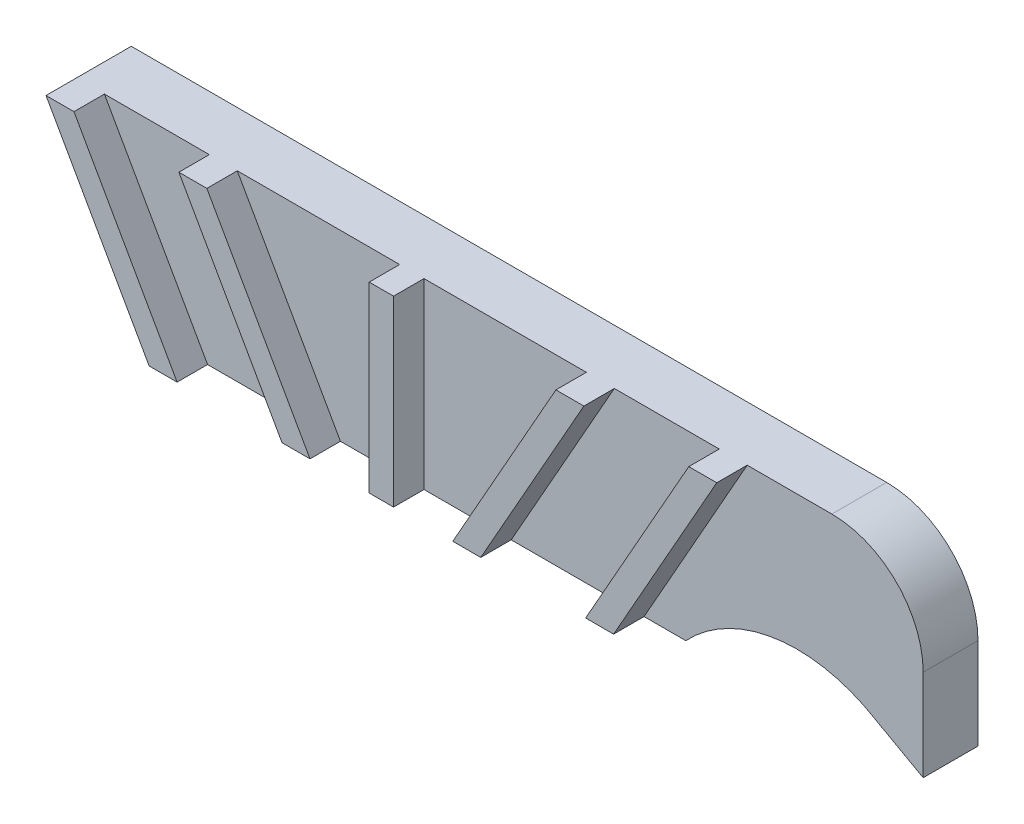
ISO-10303-21;
HEADER;
FILE_DESCRIPTION(('STEP AP214'),'2;1');
FILE_NAME('part.step','',(''),(''),'','','');
FILE_SCHEMA(('AUTOMOTIVE_DESIGN { 1 0 10303 214 1 1 1 1 }'));
ENDSEC;
DATA;
#1=APPLICATION_CONTEXT('core data for automotive mechanical design processes');
#2=APPLICATION_PROTOCOL_DEFINITION('international standard','automotive_design',2000,#1);
#3=PRODUCT_CONTEXT('',#1,'mechanical');
#4=PRODUCT('Part','Part','',(#3));
#5=PRODUCT_RELATED_PRODUCT_CATEGORY('part','',(#4));
#6=PRODUCT_DEFINITION_FORMATION('','',#4);
#7=PRODUCT_DEFINITION_CONTEXT('part definition',#1,'design');
#8=PRODUCT_DEFINITION('design','',#6,#7);
#9=PRODUCT_DEFINITION_SHAPE('','',#8);
#10=(LENGTH_UNIT() NAMED_UNIT(*) SI_UNIT(.MILLI.,.METRE.));
#11=(NAMED_UNIT(*) PLANE_ANGLE_UNIT() SI_UNIT($,.RADIAN.));
#12=(NAMED_UNIT(*) SI_UNIT($,.STERADIAN.) SOLID_ANGLE_UNIT());
#13=UNCERTAINTY_MEASURE_WITH_UNIT(LENGTH_MEASURE(1.E-05),#10,'distance_accuracy_value','');
#14=(GEOMETRIC_REPRESENTATION_CONTEXT(3) GLOBAL_UNCERTAINTY_ASSIGNED_CONTEXT((#13)) GLOBAL_UNIT_ASSIGNED_CONTEXT((#10,
#11,#12)) REPRESENTATION_CONTEXT('',''));
#15=CARTESIAN_POINT('',(0.,0.,0.));
#16=DIRECTION('',(0.,0.,1.));
#17=DIRECTION('',(1.,0.,0.));
#18=AXIS2_PLACEMENT_3D('',#15,#16,#17);
#19=CARTESIAN_POINT('',(13.5532855236969,-5.12294160247242,2.8));
#20=DIRECTION('',(-1.,0.,0.));
#21=DIRECTION('',(0.,0.,1.));
#22=AXIS2_PLACEMENT_3D('',#19,#20,#21);
#23=PLANE('',#22);
#24=DIRECTION('',(0.,-1.,0.));
#25=VECTOR('',#24,1.);
#26=CARTESIAN_POINT('',(13.5532855236969,-8.1229416024724,1.8));
#27=LINE('',#26,#25);
#28=CARTESIAN_POINT('',(13.5532855236969,-5.12294160247242,1.8));
#29=VERTEX_POINT('',#28);
#30=CARTESIAN_POINT('',(13.5532855236969,-8.1229416024724,1.8));
#31=VERTEX_POINT('',#30);
#32=EDGE_CURVE('E243',#29,#31,#27,.T.);
#33=ORIENTED_EDGE('',*,*,#32,.T.);
#34=DIRECTION('',(0.,0.,-1.));
#35=VECTOR('',#34,1.);
#36=CARTESIAN_POINT('',(13.5532855236969,-8.1229416024724,2.8));
#37=LINE('',#36,#35);
#38=CARTESIAN_POINT('',(13.5532855236969,-8.1229416024724,0.));
#39=VERTEX_POINT('',#38);
#40=EDGE_CURVE('E384',#31,#39,#37,.T.);
#41=ORIENTED_EDGE('',*,*,#40,.T.);
#42=DIRECTION('',(0.,-1.,0.));
#43=VECTOR('',#42,1.);
#44=CARTESIAN_POINT('',(13.5532855236969,-5.12294160247242,0.));
#45=LINE('',#44,#43);
#46=CARTESIAN_POINT('',(13.5532855236969,-5.12294160247242,0.));
#47=VERTEX_POINT('',#46);
#48=EDGE_CURVE('E364',#47,#39,#45,.T.);
#49=ORIENTED_EDGE('',*,*,#48,.F.);
#50=DIRECTION('',(0.,0.,-1.));
#51=VECTOR('',#50,1.);
#52=CARTESIAN_POINT('',(13.5532855236969,-5.12294160247242,2.8));
#53=LINE('',#52,#51);
#54=EDGE_CURVE('E387',#29,#47,#53,.T.);
#55=ORIENTED_EDGE('',*,*,#54,.F.);
#56=EDGE_LOOP('',(#33,#41,#49,#55));
#57=FACE_BOUND('',#56,.T.);
#58=ADVANCED_FACE('F41',(#57),#23,.F.);
#59=CARTESIAN_POINT('',(5.75682858143594,-8.1229416024724,2.8));
#60=DIRECTION('',(0.,1.,0.));
#61=DIRECTION('',(1.,0.,0.));
#62=AXIS2_PLACEMENT_3D('',#59,#60,#61);
#63=PLANE('',#62);
#64=DIRECTION('',(-1.,0.,0.));
#65=VECTOR('',#64,1.);
#66=CARTESIAN_POINT('',(-5.58507176755127,-8.1229416024724,1.8));
#67=LINE('',#66,#65);
#68=CARTESIAN_POINT('',(-3.64056322933502,-8.12294160247241,1.8));
#69=VERTEX_POINT('',#68);
#70=CARTESIAN_POINT('',(-5.58507176755127,-8.1229416024724,1.8));
#71=VERTEX_POINT('',#70);
#72=EDGE_CURVE('E292',#69,#71,#67,.T.);
#73=ORIENTED_EDGE('',*,*,#72,.T.);
#74=DIRECTION('',(0.,0.,1.));
#75=VECTOR('',#74,1.);
#76=CARTESIAN_POINT('',(-5.58507176755127,-8.1229416024724,1.8));
#77=LINE('',#76,#75);
#78=CARTESIAN_POINT('',(-5.58507176755127,-8.1229416024724,2.8));
#79=VERTEX_POINT('',#78);
#80=EDGE_CURVE('E280',#71,#79,#77,.T.);
#81=ORIENTED_EDGE('',*,*,#80,.T.);
#82=DIRECTION('',(-1.,0.,0.));
#83=VECTOR('',#82,1.);
#84=CARTESIAN_POINT('',(5.75682858143594,-8.1229416024724,2.8));
#85=LINE('',#84,#83);
#86=CARTESIAN_POINT('',(-6.5037612027946,-8.1229416024724,2.8));
#87=VERTEX_POINT('',#86);
#88=EDGE_CURVE('E360',#79,#87,#85,.T.);
#89=ORIENTED_EDGE('',*,*,#88,.T.);
#90=DIRECTION('',(0.,0.,1.));
#91=VECTOR('',#90,1.);
#92=CARTESIAN_POINT('',(-6.5037612027946,-8.1229416024724,1.8));
#93=LINE('',#92,#91);
#94=CARTESIAN_POINT('',(-6.5037612027946,-8.12294160247241,1.8));
#95=VERTEX_POINT('',#94);
#96=EDGE_CURVE('E333',#95,#87,#93,.T.);
#97=ORIENTED_EDGE('',*,*,#96,.F.);
#98=DIRECTION('',(-1.,0.,0.));
#99=VECTOR('',#98,1.);
#100=CARTESIAN_POINT('',(-9.94884658495708,-8.1229416024724,1.8));
#101=LINE('',#100,#99);
#102=CARTESIAN_POINT('',(-9.94884658495708,-8.1229416024724,1.8));
#103=VERTEX_POINT('',#102);
#104=EDGE_CURVE('E317',#95,#103,#101,.T.);
#105=ORIENTED_EDGE('',*,*,#104,.T.);
#106=DIRECTION('',(0.,0.,1.));
#107=VECTOR('',#106,1.);
#108=CARTESIAN_POINT('',(-9.94884658495708,-8.1229416024724,1.8));
#109=LINE('',#108,#107);
#110=CARTESIAN_POINT('',(-9.94884658495708,-8.1229416024724,2.8));
#111=VERTEX_POINT('',#110);
#112=EDGE_CURVE('E328',#103,#111,#109,.T.);
#113=ORIENTED_EDGE('',*,*,#112,.T.);
#114=CARTESIAN_POINT('',(-10.8675360202004,-8.12294160247241,2.8));
#115=VERTEX_POINT('',#114);
#116=EDGE_CURVE('E351',#111,#115,#85,.T.);
#117=ORIENTED_EDGE('',*,*,#116,.T.);
#118=DIRECTION('',(0.,0.,-1.));
#119=VECTOR('',#118,1.);
#120=CARTESIAN_POINT('',(-10.8675360202004,-8.12294160247241,2.8));
#121=LINE('',#120,#119);
#122=CARTESIAN_POINT('',(-10.8675360202004,-8.12294160247241,0.));
#123=VERTEX_POINT('',#122);
#124=EDGE_CURVE('E373',#115,#123,#121,.T.);
#125=ORIENTED_EDGE('',*,*,#124,.T.);
#126=DIRECTION('',(-1.,0.,0.));
#127=VECTOR('',#126,1.);
#128=CARTESIAN_POINT('',(5.75682858143594,-8.1229416024724,0.));
#129=LINE('',#128,#127);
#130=CARTESIAN_POINT('',(5.75682858143594,-8.1229416024724,0.));
#131=VERTEX_POINT('',#130);
#132=EDGE_CURVE('E349',#131,#123,#129,.T.);
#133=ORIENTED_EDGE('',*,*,#132,.F.);
#134=DIRECTION('',(0.,0.,-1.));
#135=VECTOR('',#134,1.);
#136=CARTESIAN_POINT('',(5.75682858143594,-8.1229416024724,2.8));
#137=LINE('',#136,#135);
#138=CARTESIAN_POINT('',(5.75682858143594,-8.1229416024724,1.8));
#139=VERTEX_POINT('',#138);
#140=EDGE_CURVE('E379',#139,#131,#137,.T.);
#141=ORIENTED_EDGE('',*,*,#140,.F.);
#142=DIRECTION('',(-1.,0.,0.));
#143=VECTOR('',#142,1.);
#144=CARTESIAN_POINT('',(4.38640956153037,-8.1229416024724,1.8));
#145=LINE('',#144,#143);
#146=CARTESIAN_POINT('',(4.38640956153037,-8.1229416024724,1.8));
#147=VERTEX_POINT('',#146);
#148=EDGE_CURVE('E237',#139,#147,#145,.T.);
#149=ORIENTED_EDGE('',*,*,#148,.T.);
#150=DIRECTION('',(0.,0.,1.));
#151=VECTOR('',#150,1.);
#152=CARTESIAN_POINT('',(4.38640956153037,-8.1229416024724,1.8));
#153=LINE('',#152,#151);
#154=CARTESIAN_POINT('',(4.38640956153037,-8.1229416024724,2.8));
#155=VERTEX_POINT('',#154);
#156=EDGE_CURVE('E220',#147,#155,#153,.T.);
#157=ORIENTED_EDGE('',*,*,#156,.T.);
#158=CARTESIAN_POINT('',(3.46772012628704,-8.1229416024724,2.8));
#159=VERTEX_POINT('',#158);
#160=EDGE_CURVE('E233',#155,#159,#85,.T.);
#161=ORIENTED_EDGE('',*,*,#160,.T.);
#162=DIRECTION('',(0.,0.,1.));
#163=VECTOR('',#162,1.);
#164=CARTESIAN_POINT('',(3.46772012628704,-8.1229416024724,1.8));
#165=LINE('',#164,#163);
#166=CARTESIAN_POINT('',(3.46772012628704,-8.1229416024724,1.8));
#167=VERTEX_POINT('',#166);
#168=EDGE_CURVE('E248',#167,#159,#165,.T.);
#169=ORIENTED_EDGE('',*,*,#168,.F.);
#170=DIRECTION('',(-1.,0.,0.));
#171=VECTOR('',#170,1.);
#172=CARTESIAN_POINT('',(3.46772012628704,-8.1229416024724,1.8));
#173=LINE('',#172,#171);
#174=CARTESIAN_POINT('',(0.0226347441245577,-8.1229416024724,1.8));
#175=VERTEX_POINT('',#174);
#176=EDGE_CURVE('E268',#167,#175,#173,.T.);
#177=ORIENTED_EDGE('',*,*,#176,.T.);
#178=DIRECTION('',(0.,0.,1.));
#179=VECTOR('',#178,1.);
#180=CARTESIAN_POINT('',(0.0226347441245577,-8.1229416024724,1.8));
#181=LINE('',#180,#179);
#182=CARTESIAN_POINT('',(0.0226347441245577,-8.1229416024724,2.8));
#183=VERTEX_POINT('',#182);
#184=EDGE_CURVE('E253',#175,#183,#181,.T.);
#185=ORIENTED_EDGE('',*,*,#184,.T.);
#186=CARTESIAN_POINT('',(-0.896054691118764,-8.1229416024724,2.8));
#187=VERTEX_POINT('',#186);
#188=EDGE_CURVE('E435',#183,#187,#85,.T.);
#189=ORIENTED_EDGE('',*,*,#188,.T.);
#190=DIRECTION('',(0.,0.,1.));
#191=VECTOR('',#190,1.);
#192=CARTESIAN_POINT('',(-0.896054691118764,-8.1229416024724,1.8));
#193=LINE('',#192,#191);
#194=CARTESIAN_POINT('',(-0.896054691118765,-8.12294160247241,1.8));
#195=VERTEX_POINT('',#194);
#196=EDGE_CURVE('E296',#195,#187,#193,.T.);
#197=ORIENTED_EDGE('',*,*,#196,.F.);
#198=DIRECTION('',(-1.,0.,0.));
#199=VECTOR('',#198,1.);
#200=CARTESIAN_POINT('',(-0.896054691118764,-8.1229416024724,1.8));
#201=LINE('',#200,#199);
#202=CARTESIAN_POINT('',(-2.84056322933501,-8.1229416024724,1.8));
#203=VERTEX_POINT('',#202);
#204=EDGE_CURVE('E314',#195,#203,#201,.T.);
#205=ORIENTED_EDGE('',*,*,#204,.T.);
#206=DIRECTION('',(0.,0.,1.));
#207=VECTOR('',#206,1.);
#208=CARTESIAN_POINT('',(-2.84056322933501,-8.1229416024724,1.8));
#209=LINE('',#208,#207);
#210=CARTESIAN_POINT('',(-2.84056322933501,-8.1229416024724,2.8));
#211=VERTEX_POINT('',#210);
#212=EDGE_CURVE('E300',#203,#211,#209,.T.);
#213=ORIENTED_EDGE('',*,*,#212,.T.);
#214=CARTESIAN_POINT('',(-3.64056322933502,-8.1229416024724,2.8));
#215=VERTEX_POINT('',#214);
#216=EDGE_CURVE('E446',#211,#215,#85,.T.);
#217=ORIENTED_EDGE('',*,*,#216,.T.);
#218=DIRECTION('',(0.,0.,1.));
#219=VECTOR('',#218,1.);
#220=CARTESIAN_POINT('',(-3.64056322933502,-8.1229416024724,1.8));
#221=LINE('',#220,#219);
#222=EDGE_CURVE('E274',#69,#215,#221,.T.);
#223=ORIENTED_EDGE('',*,*,#222,.F.);
#224=EDGE_LOOP('',(#73,#81,#89,#97,#105,#113,#117,#125,#133,#141,#149,#157,#161,#169,#177,#185,
#189,#197,#205,#213,#217,#223));
#225=FACE_BOUND('',#224,.T.);
#226=ADVANCED_FACE('F401',(#225),#63,.F.);
#227=CARTESIAN_POINT('',(10.5532855236969,-5.12294160247242,2.8));
#228=DIRECTION('',(0.,0.,1.));
#229=DIRECTION('',(1.,0.,0.));
#230=AXIS2_PLACEMENT_3D('',#227,#228,#229);
#231=PLANE('',#230);
#232=DIRECTION('',(0.,-1.,0.));
#233=VECTOR('',#232,1.);
#234=CARTESIAN_POINT('',(-3.64056322933502,-8.1229416024724,2.8));
#235=LINE('',#234,#233);
#236=CARTESIAN_POINT('',(-3.64056322933502,-2.12294160247242,2.8));
#237=VERTEX_POINT('',#236);
#238=EDGE_CURVE('E286',#237,#215,#235,.T.);
#239=ORIENTED_EDGE('',*,*,#238,.T.);
#240=ORIENTED_EDGE('',*,*,#216,.F.);
#241=DIRECTION('',(0.,1.,0.));
#242=VECTOR('',#241,1.);
#243=CARTESIAN_POINT('',(-2.84056322933501,-8.1229416024724,2.8));
#244=LINE('',#243,#242);
#245=CARTESIAN_POINT('',(-2.84056322933502,-2.12294160247242,2.8));
#246=VERTEX_POINT('',#245);
#247=EDGE_CURVE('E308',#211,#246,#244,.T.);
#248=ORIENTED_EDGE('',*,*,#247,.T.);
#249=DIRECTION('',(1.,0.,0.));
#250=VECTOR('',#249,1.);
#251=CARTESIAN_POINT('',(-14.254932241719,-2.12294160247242,2.8));
#252=LINE('',#251,#250);
#253=EDGE_CURVE('E422',#237,#246,#252,.T.);
#254=ORIENTED_EDGE('',*,*,#253,.F.);
#255=EDGE_LOOP('',(#239,#240,#248,#254));
#256=FACE_BOUND('',#255,.T.);
#257=ADVANCED_FACE('F462',(#256),#231,.T.);
#258=DIRECTION('',(-0.491627324979726,-0.870805703548891,0.));
#259=VECTOR('',#258,1.);
#260=CARTESIAN_POINT('',(2.49134153039982,-2.12294160247242,2.8));
#261=LINE('',#260,#259);
#262=CARTESIAN_POINT('',(2.49134153039982,-2.12294160247242,2.8));
#263=VERTEX_POINT('',#262);
#264=EDGE_CURVE('E284',#263,#187,#261,.T.);
#265=ORIENTED_EDGE('',*,*,#264,.T.);
#266=ORIENTED_EDGE('',*,*,#188,.F.);
#267=DIRECTION('',(0.491627324979726,0.870805703548891,0.));
#268=VECTOR('',#267,1.);
#269=CARTESIAN_POINT('',(0.0226347441245577,-8.1229416024724,2.8));
#270=LINE('',#269,#268);
#271=CARTESIAN_POINT('',(3.41003096564315,-2.12294160247242,2.8));
#272=VERTEX_POINT('',#271);
#273=EDGE_CURVE('E256',#183,#272,#270,.T.);
#274=ORIENTED_EDGE('',*,*,#273,.T.);
#275=EDGE_CURVE('E228',#263,#272,#252,.T.);
#276=ORIENTED_EDGE('',*,*,#275,.F.);
#277=EDGE_LOOP('',(#265,#266,#274,#276));
#278=FACE_BOUND('',#277,.T.);
#279=ADVANCED_FACE('F434',(#278),#231,.T.);
#280=DIRECTION('',(0.491627324979726,0.870805703548891,0.));
#281=VECTOR('',#280,1.);
#282=CARTESIAN_POINT('',(4.38640956153037,-8.1229416024724,2.8));
#283=LINE('',#282,#281);
#284=CARTESIAN_POINT('',(7.77380578304896,-2.12294160247242,2.8));
#285=VERTEX_POINT('',#284);
#286=EDGE_CURVE('E213',#155,#285,#283,.T.);
#287=ORIENTED_EDGE('',*,*,#286,.T.);
#288=CARTESIAN_POINT('',(6.85511634780563,-2.12294160247242,2.8));
#289=VERTEX_POINT('',#288);
#290=EDGE_CURVE('E217',#289,#285,#252,.T.);
#291=ORIENTED_EDGE('',*,*,#290,.F.);
#292=DIRECTION('',(-0.491627324979726,-0.870805703548891,0.));
#293=VECTOR('',#292,1.);
#294=CARTESIAN_POINT('',(3.46772012628704,-8.1229416024724,2.8));
#295=LINE('',#294,#293);
#296=EDGE_CURVE('E263',#289,#159,#295,.T.);
#297=ORIENTED_EDGE('',*,*,#296,.T.);
#298=ORIENTED_EDGE('',*,*,#160,.F.);
#299=EDGE_LOOP('',(#287,#291,#297,#298));
#300=FACE_BOUND('',#299,.T.);
#301=ADVANCED_FACE('F235',(#300),#231,.T.);
#302=DIRECTION('',(-0.491627324979726,0.870805703548891,0.));
#303=VECTOR('',#302,1.);
#304=CARTESIAN_POINT('',(-9.94884658495708,-8.1229416024724,2.8));
#305=LINE('',#304,#303);
#306=CARTESIAN_POINT('',(-13.3362428064757,-2.12294160247242,2.8));
#307=VERTEX_POINT('',#306);
#308=EDGE_CURVE('E288',#111,#307,#305,.T.);
#309=ORIENTED_EDGE('',*,*,#308,.T.);
#310=CARTESIAN_POINT('',(-14.254932241719,-2.12294160247242,2.8));
#311=VERTEX_POINT('',#310);
#312=EDGE_CURVE('E231',#311,#307,#252,.T.);
#313=ORIENTED_EDGE('',*,*,#312,.F.);
#314=DIRECTION('',(-0.491627324979726,0.870805703548891,0.));
#315=VECTOR('',#314,1.);
#316=CARTESIAN_POINT('',(-10.8675360202004,-8.12294160247241,2.8));
#317=LINE('',#316,#315);
#318=EDGE_CURVE('E227',#115,#311,#317,.T.);
#319=ORIENTED_EDGE('',*,*,#318,.F.);
#320=ORIENTED_EDGE('',*,*,#116,.F.);
#321=EDGE_LOOP('',(#309,#313,#319,#320));
#322=FACE_BOUND('',#321,.T.);
#323=ADVANCED_FACE('F404',(#322),#231,.T.);
#324=CARTESIAN_POINT('',(-10.8675360202004,-8.12294160247241,2.8));
#325=DIRECTION('',(0.870805703548891,0.491627324979726,0.));
#326=DIRECTION('',(0.491627324979726,-0.870805703548891,0.));
#327=AXIS2_PLACEMENT_3D('',#324,#325,#326);
#328=PLANE('',#327);
#329=DIRECTION('',(-0.491627324979726,0.870805703548891,0.));
#330=VECTOR('',#329,1.);
#331=CARTESIAN_POINT('',(-10.8675360202004,-8.12294160247241,0.));
#332=LINE('',#331,#330);
#333=CARTESIAN_POINT('',(-14.254932241719,-2.12294160247242,0.));
#334=VERTEX_POINT('',#333);
#335=EDGE_CURVE('E346',#123,#334,#332,.T.);
#336=ORIENTED_EDGE('',*,*,#335,.F.);
#337=ORIENTED_EDGE('',*,*,#124,.F.);
#338=ORIENTED_EDGE('',*,*,#318,.T.);
#339=DIRECTION('',(0.,0.,-1.));
#340=VECTOR('',#339,1.);
#341=CARTESIAN_POINT('',(-14.254932241719,-2.12294160247242,2.8));
#342=LINE('',#341,#340);
#343=EDGE_CURVE('E47',#311,#334,#342,.T.);
#344=ORIENTED_EDGE('',*,*,#343,.T.);
#345=EDGE_LOOP('',(#336,#337,#338,#344));
#346=FACE_BOUND('',#345,.T.);
#347=ADVANCED_FACE('F43',(#346),#328,.F.);
#348=CARTESIAN_POINT('',(-14.254932241719,-2.12294160247242,2.8));
#349=DIRECTION('',(0.,-1.,0.));
#350=DIRECTION('',(0.,0.,1.));
#351=AXIS2_PLACEMENT_3D('',#348,#349,#350);
#352=PLANE('',#351);
#353=DIRECTION('',(1.,0.,0.));
#354=VECTOR('',#353,1.);
#355=CARTESIAN_POINT('',(-8.97246798906986,-2.12294160247242,1.8));
#356=LINE('',#355,#354);
#357=CARTESIAN_POINT('',(-8.97246798906986,-2.12294160247242,1.8));
#358=VERTEX_POINT('',#357);
#359=CARTESIAN_POINT('',(-3.64056322933502,-2.12294160247242,1.8));
#360=VERTEX_POINT('',#359);
#361=EDGE_CURVE('E287',#358,#360,#356,.T.);
#362=ORIENTED_EDGE('',*,*,#361,.T.);
#363=DIRECTION('',(0.,0.,1.));
#364=VECTOR('',#363,1.);
#365=CARTESIAN_POINT('',(-3.64056322933502,-2.12294160247242,1.8));
#366=LINE('',#365,#364);
#367=EDGE_CURVE('E275',#360,#237,#366,.T.);
#368=ORIENTED_EDGE('',*,*,#367,.T.);
#369=ORIENTED_EDGE('',*,*,#253,.T.);
#370=DIRECTION('',(0.,0.,1.));
#371=VECTOR('',#370,1.);
#372=CARTESIAN_POINT('',(-2.84056322933502,-2.12294160247242,1.8));
#373=LINE('',#372,#371);
#374=CARTESIAN_POINT('',(-2.84056322933502,-2.12294160247242,1.8));
#375=VERTEX_POINT('',#374);
#376=EDGE_CURVE('E301',#375,#246,#373,.T.);
#377=ORIENTED_EDGE('',*,*,#376,.F.);
#378=DIRECTION('',(1.,0.,0.));
#379=VECTOR('',#378,1.);
#380=CARTESIAN_POINT('',(2.49134153039982,-2.12294160247242,1.8));
#381=LINE('',#380,#379);
#382=CARTESIAN_POINT('',(2.49134153039982,-2.12294160247242,1.8));
#383=VERTEX_POINT('',#382);
#384=EDGE_CURVE('E298',#375,#383,#381,.T.);
#385=ORIENTED_EDGE('',*,*,#384,.T.);
#386=DIRECTION('',(0.,0.,1.));
#387=VECTOR('',#386,1.);
#388=CARTESIAN_POINT('',(2.49134153039982,-2.12294160247242,1.8));
#389=LINE('',#388,#387);
#390=EDGE_CURVE('E264',#383,#263,#389,.T.);
#391=ORIENTED_EDGE('',*,*,#390,.T.);
#392=ORIENTED_EDGE('',*,*,#275,.T.);
#393=DIRECTION('',(0.,0.,1.));
#394=VECTOR('',#393,1.);
#395=CARTESIAN_POINT('',(3.41003096564315,-2.12294160247242,1.8));
#396=LINE('',#395,#394);
#397=CARTESIAN_POINT('',(3.41003096564315,-2.12294160247242,1.8));
#398=VERTEX_POINT('',#397);
#399=EDGE_CURVE('E239',#398,#272,#396,.T.);
#400=ORIENTED_EDGE('',*,*,#399,.F.);
#401=DIRECTION('',(1.,0.,0.));
#402=VECTOR('',#401,1.);
#403=CARTESIAN_POINT('',(6.85511634780563,-2.12294160247242,1.8));
#404=LINE('',#403,#402);
#405=CARTESIAN_POINT('',(6.85511634780563,-2.12294160247242,1.8));
#406=VERTEX_POINT('',#405);
#407=EDGE_CURVE('E254',#398,#406,#404,.T.);
#408=ORIENTED_EDGE('',*,*,#407,.T.);
#409=DIRECTION('',(0.,0.,1.));
#410=VECTOR('',#409,1.);
#411=CARTESIAN_POINT('',(6.85511634780563,-2.12294160247242,1.8));
#412=LINE('',#411,#410);
#413=EDGE_CURVE('E224',#406,#289,#412,.T.);
#414=ORIENTED_EDGE('',*,*,#413,.T.);
#415=ORIENTED_EDGE('',*,*,#290,.T.);
#416=DIRECTION('',(0.,0.,1.));
#417=VECTOR('',#416,1.);
#418=CARTESIAN_POINT('',(7.77380578304896,-2.12294160247242,1.8));
#419=LINE('',#418,#417);
#420=CARTESIAN_POINT('',(7.77380578304896,-2.12294160247242,1.8));
#421=VERTEX_POINT('',#420);
#422=EDGE_CURVE('E206',#421,#285,#419,.T.);
#423=ORIENTED_EDGE('',*,*,#422,.F.);
#424=DIRECTION('',(1.,0.,0.));
#425=VECTOR('',#424,1.);
#426=CARTESIAN_POINT('',(13.5532855236969,-2.12294160247242,1.8));
#427=LINE('',#426,#425);
#428=CARTESIAN_POINT('',(10.5532855236969,-2.12294160247242,1.8));
#429=VERTEX_POINT('',#428);
#430=EDGE_CURVE('E250',#421,#429,#427,.T.);
#431=ORIENTED_EDGE('',*,*,#430,.T.);
#432=DIRECTION('',(0.,0.,-1.));
#433=VECTOR('',#432,1.);
#434=CARTESIAN_POINT('',(10.5532855236969,-2.12294160247242,2.8));
#435=LINE('',#434,#433);
#436=CARTESIAN_POINT('',(10.5532855236969,-2.12294160247242,0.));
#437=VERTEX_POINT('',#436);
#438=EDGE_CURVE('E390',#429,#437,#435,.T.);
#439=ORIENTED_EDGE('',*,*,#438,.T.);
#440=DIRECTION('',(1.,0.,0.));
#441=VECTOR('',#440,1.);
#442=CARTESIAN_POINT('',(-14.254932241719,-2.12294160247242,0.));
#443=LINE('',#442,#441);
#444=EDGE_CURVE('E359',#334,#437,#443,.T.);
#445=ORIENTED_EDGE('',*,*,#444,.F.);
#446=ORIENTED_EDGE('',*,*,#343,.F.);
#447=ORIENTED_EDGE('',*,*,#312,.T.);
#448=DIRECTION('',(0.,0.,1.));
#449=VECTOR('',#448,1.);
#450=CARTESIAN_POINT('',(-13.3362428064757,-2.12294160247242,1.8));
#451=LINE('',#450,#449);
#452=CARTESIAN_POINT('',(-13.3362428064757,-2.12294160247242,1.8));
#453=VERTEX_POINT('',#452);
#454=EDGE_CURVE('E341',#453,#307,#451,.T.);
#455=ORIENTED_EDGE('',*,*,#454,.F.);
#456=DIRECTION('',(1.,0.,0.));
#457=VECTOR('',#456,1.);
#458=CARTESIAN_POINT('',(-13.3362428064757,-2.12294160247242,1.8));
#459=LINE('',#458,#457);
#460=CARTESIAN_POINT('',(-9.89115742431319,-2.12294160247242,1.8));
#461=VERTEX_POINT('',#460);
#462=EDGE_CURVE('E324',#453,#461,#459,.T.);
#463=ORIENTED_EDGE('',*,*,#462,.T.);
#464=DIRECTION('',(0.,0.,1.));
#465=VECTOR('',#464,1.);
#466=CARTESIAN_POINT('',(-9.89115742431319,-2.12294160247242,1.8));
#467=LINE('',#466,#465);
#468=CARTESIAN_POINT('',(-9.89115742431319,-2.12294160247242,2.8));
#469=VERTEX_POINT('',#468);
#470=EDGE_CURVE('E336',#461,#469,#467,.T.);
#471=ORIENTED_EDGE('',*,*,#470,.T.);
#472=CARTESIAN_POINT('',(-8.97246798906986,-2.12294160247242,2.8));
#473=VERTEX_POINT('',#472);
#474=EDGE_CURVE('E354',#469,#473,#252,.T.);
#475=ORIENTED_EDGE('',*,*,#474,.T.);
#476=DIRECTION('',(0.,0.,1.));
#477=VECTOR('',#476,1.);
#478=CARTESIAN_POINT('',(-8.97246798906986,-2.12294160247242,1.8));
#479=LINE('',#478,#477);
#480=EDGE_CURVE('E279',#358,#473,#479,.T.);
#481=ORIENTED_EDGE('',*,*,#480,.F.);
#482=EDGE_LOOP('',(#362,#368,#369,#377,#385,#391,#392,#400,#408,#414,#415,#423,#431,#439,#445,
#446,#447,#455,#463,#471,#475,#481));
#483=FACE_BOUND('',#482,.T.);
#484=ADVANCED_FACE('F225',(#483),#352,.F.);
#485=CARTESIAN_POINT('',(10.5532855236969,-5.12294160247242,2.8));
#486=DIRECTION('',(0.,0.,-1.));
#487=DIRECTION('',(-1.,0.,0.));
#488=AXIS2_PLACEMENT_3D('',#485,#486,#487);
#489=CYLINDRICAL_SURFACE('',#488,2.99999999999999);
#490=ORIENTED_EDGE('',*,*,#54,.T.);
#491=CARTESIAN_POINT('',(10.5532855236969,-5.12294160247242,0.));
#492=DIRECTION('',(0.,0.,-1.));
#493=DIRECTION('',(1.,0.,0.));
#494=AXIS2_PLACEMENT_3D('',#491,#492,#493);
#495=CIRCLE('',#494,2.99999999999999);
#496=EDGE_CURVE('E363',#437,#47,#495,.T.);
#497=ORIENTED_EDGE('',*,*,#496,.F.);
#498=ORIENTED_EDGE('',*,*,#438,.F.);
#499=CARTESIAN_POINT('',(10.5532855236969,-5.12294160247242,1.8));
#500=DIRECTION('',(0.,0.,1.));
#501=DIRECTION('',(-1.,0.,0.));
#502=AXIS2_PLACEMENT_3D('',#499,#500,#501);
#503=CIRCLE('',#502,2.99999999999999);
#504=EDGE_CURVE('E348',#29,#429,#503,.T.);
#505=ORIENTED_EDGE('',*,*,#504,.F.);
#506=EDGE_LOOP('',(#490,#497,#498,#505));
#507=FACE_BOUND('',#506,.T.);
#508=ADVANCED_FACE('F484',(#507),#489,.T.);
#509=CARTESIAN_POINT('',(13.5532855236969,-8.1229416024724,2.8));
#510=DIRECTION('',(0.485119556305623,0.874447834973497,0.));
#511=DIRECTION('',(0.874447834973497,-0.485119556305623,0.));
#512=AXIS2_PLACEMENT_3D('',#509,#510,#511);
#513=PLANE('',#512);
#514=DIRECTION('',(0.,0.,-1.));
#515=VECTOR('',#514,1.);
#516=CARTESIAN_POINT('',(11.9839251052848,-7.25230369885546,2.8));
#517=LINE('',#516,#515);
#518=CARTESIAN_POINT('',(11.9839251052848,-7.25230369885546,1.8));
#519=VERTEX_POINT('',#518);
#520=CARTESIAN_POINT('',(11.9839251052848,-7.25230369885546,0.));
#521=VERTEX_POINT('',#520);
#522=EDGE_CURVE('E382',#519,#521,#517,.T.);
#523=ORIENTED_EDGE('',*,*,#522,.T.);
#524=DIRECTION('',(-0.874447834973497,0.485119556305623,0.));
#525=VECTOR('',#524,1.);
#526=CARTESIAN_POINT('',(13.5532855236969,-8.1229416024724,0.));
#527=LINE('',#526,#525);
#528=EDGE_CURVE('E367',#39,#521,#527,.T.);
#529=ORIENTED_EDGE('',*,*,#528,.F.);
#530=ORIENTED_EDGE('',*,*,#40,.F.);
#531=DIRECTION('',(0.874447834973497,-0.485119556305623,0.));
#532=VECTOR('',#531,1.);
#533=CARTESIAN_POINT('',(13.5532855236969,-8.1229416024724,1.8));
#534=LINE('',#533,#532);
#535=EDGE_CURVE('E340',#519,#31,#534,.T.);
#536=ORIENTED_EDGE('',*,*,#535,.F.);
#537=EDGE_LOOP('',(#523,#529,#530,#536));
#538=FACE_BOUND('',#537,.T.);
#539=ADVANCED_FACE('F481',(#538),#513,.F.);
#540=CARTESIAN_POINT('',(9.40873473073451,-11.538140202366,2.8));
#541=DIRECTION('',(0.,0.,-1.));
#542=DIRECTION('',(-1.,0.,0.));
#543=AXIS2_PLACEMENT_3D('',#540,#541,#542);
#544=CYLINDRICAL_SURFACE('',#543,5.);
#545=ORIENTED_EDGE('',*,*,#140,.T.);
#546=CARTESIAN_POINT('',(9.40873473073451,-11.538140202366,0.));
#547=DIRECTION('',(0.,0.,1.));
#548=DIRECTION('',(1.,0.,0.));
#549=AXIS2_PLACEMENT_3D('',#546,#547,#548);
#550=CIRCLE('',#549,5.);
#551=EDGE_CURVE('E372',#521,#131,#550,.T.);
#552=ORIENTED_EDGE('',*,*,#551,.F.);
#553=ORIENTED_EDGE('',*,*,#522,.F.);
#554=CARTESIAN_POINT('',(9.40873473073451,-11.538140202366,1.8));
#555=DIRECTION('',(0.,0.,1.));
#556=DIRECTION('',(-1.,0.,0.));
#557=AXIS2_PLACEMENT_3D('',#554,#555,#556);
#558=CIRCLE('',#557,5.);
#559=EDGE_CURVE('E11',#139,#519,#558,.F.);
#560=ORIENTED_EDGE('',*,*,#559,.F.);
#561=EDGE_LOOP('',(#545,#552,#553,#560));
#562=FACE_BOUND('',#561,.T.);
#563=ADVANCED_FACE('F505',(#562),#544,.F.);
#564=DIRECTION('',(-0.491627324979726,0.870805703548891,0.));
#565=VECTOR('',#564,1.);
#566=CARTESIAN_POINT('',(-8.97246798906986,-2.12294160247242,2.8));
#567=LINE('',#566,#565);
#568=EDGE_CURVE('E281',#79,#473,#567,.T.);
#569=ORIENTED_EDGE('',*,*,#568,.T.);
#570=ORIENTED_EDGE('',*,*,#474,.F.);
#571=DIRECTION('',(0.491627324979726,-0.870805703548891,0.));
#572=VECTOR('',#571,1.);
#573=CARTESIAN_POINT('',(-6.5037612027946,-8.1229416024724,2.8));
#574=LINE('',#573,#572);
#575=EDGE_CURVE('E322',#469,#87,#574,.T.);
#576=ORIENTED_EDGE('',*,*,#575,.T.);
#577=ORIENTED_EDGE('',*,*,#88,.F.);
#578=EDGE_LOOP('',(#569,#570,#576,#577));
#579=FACE_BOUND('',#578,.T.);
#580=ADVANCED_FACE('F453',(#579),#231,.T.);
#581=CARTESIAN_POINT('',(10.5532855236969,-5.12294160247242,0.));
#582=DIRECTION('',(0.,0.,1.));
#583=DIRECTION('',(1.,0.,0.));
#584=AXIS2_PLACEMENT_3D('',#581,#582,#583);
#585=PLANE('',#584);
#586=ORIENTED_EDGE('',*,*,#335,.T.);
#587=ORIENTED_EDGE('',*,*,#444,.T.);
#588=ORIENTED_EDGE('',*,*,#496,.T.);
#589=ORIENTED_EDGE('',*,*,#48,.T.);
#590=ORIENTED_EDGE('',*,*,#528,.T.);
#591=ORIENTED_EDGE('',*,*,#551,.T.);
#592=ORIENTED_EDGE('',*,*,#132,.T.);
#593=EDGE_LOOP('',(#586,#587,#588,#589,#590,#591,#592));
#594=FACE_BOUND('',#593,.T.);
#595=ADVANCED_FACE('F400',(#594),#585,.F.);
#596=CARTESIAN_POINT('',(-6.5037612027946,-8.1229416024724,1.8));
#597=DIRECTION('',(0.870805703548891,0.491627324979726,0.));
#598=DIRECTION('',(0.491627324979726,-0.870805703548891,0.));
#599=AXIS2_PLACEMENT_3D('',#596,#597,#598);
#600=PLANE('',#599);
#601=ORIENTED_EDGE('',*,*,#575,.F.);
#602=ORIENTED_EDGE('',*,*,#470,.F.);
#603=DIRECTION('',(0.491627324979726,-0.870805703548891,0.));
#604=VECTOR('',#603,1.);
#605=CARTESIAN_POINT('',(-6.5037612027946,-8.1229416024724,1.8));
#606=LINE('',#605,#604);
#607=EDGE_CURVE('E329',#461,#95,#606,.T.);
#608=ORIENTED_EDGE('',*,*,#607,.T.);
#609=ORIENTED_EDGE('',*,*,#96,.T.);
#610=EDGE_LOOP('',(#601,#602,#608,#609));
#611=FACE_BOUND('',#610,.T.);
#612=ADVANCED_FACE('F417',(#611),#600,.F.);
#613=CARTESIAN_POINT('',(-9.94884658495708,-8.1229416024724,1.8));
#614=DIRECTION('',(-0.870805703548891,-0.491627324979726,0.));
#615=DIRECTION('',(-0.491627324979726,0.870805703548891,0.));
#616=AXIS2_PLACEMENT_3D('',#613,#614,#615);
#617=PLANE('',#616);
#618=ORIENTED_EDGE('',*,*,#308,.F.);
#619=ORIENTED_EDGE('',*,*,#112,.F.);
#620=DIRECTION('',(-0.491627324979726,0.870805703548891,0.));
#621=VECTOR('',#620,1.);
#622=CARTESIAN_POINT('',(-9.94884658495708,-8.1229416024724,1.8));
#623=LINE('',#622,#621);
#624=EDGE_CURVE('E325',#103,#453,#623,.T.);
#625=ORIENTED_EDGE('',*,*,#624,.T.);
#626=ORIENTED_EDGE('',*,*,#454,.T.);
#627=EDGE_LOOP('',(#618,#619,#625,#626));
#628=FACE_BOUND('',#627,.T.);
#629=ADVANCED_FACE('F407',(#628),#617,.F.);
#630=CARTESIAN_POINT('',(0.,-4.24588320494483,1.8));
#631=DIRECTION('',(0.,0.,-1.));
#632=DIRECTION('',(-1.,0.,0.));
#633=AXIS2_PLACEMENT_3D('',#630,#631,#632);
#634=PLANE('',#633);
#635=ORIENTED_EDGE('',*,*,#104,.F.);
#636=ORIENTED_EDGE('',*,*,#607,.F.);
#637=ORIENTED_EDGE('',*,*,#462,.F.);
#638=ORIENTED_EDGE('',*,*,#624,.F.);
#639=EDGE_LOOP('',(#635,#636,#637,#638));
#640=FACE_BOUND('',#639,.T.);
#641=ADVANCED_FACE('F415',(#640),#634,.F.);
#642=CARTESIAN_POINT('',(3.46772012628704,-8.1229416024724,1.8));
#643=DIRECTION('',(0.870805703548891,-0.491627324979726,0.));
#644=DIRECTION('',(-0.491627324979726,-0.870805703548891,0.));
#645=AXIS2_PLACEMENT_3D('',#642,#643,#644);
#646=PLANE('',#645);
#647=ORIENTED_EDGE('',*,*,#296,.F.);
#648=ORIENTED_EDGE('',*,*,#413,.F.);
#649=DIRECTION('',(-0.491627324979726,-0.870805703548891,0.));
#650=VECTOR('',#649,1.);
#651=CARTESIAN_POINT('',(3.46772012628704,-8.1229416024724,1.8));
#652=LINE('',#651,#650);
#653=EDGE_CURVE('E265',#406,#167,#652,.T.);
#654=ORIENTED_EDGE('',*,*,#653,.T.);
#655=ORIENTED_EDGE('',*,*,#168,.T.);
#656=EDGE_LOOP('',(#647,#648,#654,#655));
#657=FACE_BOUND('',#656,.T.);
#658=ADVANCED_FACE('F442',(#657),#646,.F.);
#659=CARTESIAN_POINT('',(0.0226347441245577,-8.1229416024724,1.8));
#660=DIRECTION('',(-0.870805703548891,0.491627324979726,0.));
#661=DIRECTION('',(0.491627324979726,0.870805703548891,0.));
#662=AXIS2_PLACEMENT_3D('',#659,#660,#661);
#663=PLANE('',#662);
#664=ORIENTED_EDGE('',*,*,#273,.F.);
#665=ORIENTED_EDGE('',*,*,#184,.F.);
#666=DIRECTION('',(0.491627324979726,0.870805703548891,0.));
#667=VECTOR('',#666,1.);
#668=CARTESIAN_POINT('',(0.0226347441245577,-8.1229416024724,1.8));
#669=LINE('',#668,#667);
#670=EDGE_CURVE('E266',#175,#398,#669,.T.);
#671=ORIENTED_EDGE('',*,*,#670,.T.);
#672=ORIENTED_EDGE('',*,*,#399,.T.);
#673=EDGE_LOOP('',(#664,#665,#671,#672));
#674=FACE_BOUND('',#673,.T.);
#675=ADVANCED_FACE('F436',(#674),#663,.F.);
#676=CARTESIAN_POINT('',(0.,-4.24588320494483,1.8));
#677=DIRECTION('',(0.,0.,-1.));
#678=DIRECTION('',(-1.,0.,0.));
#679=AXIS2_PLACEMENT_3D('',#676,#677,#678);
#680=PLANE('',#679);
#681=ORIENTED_EDGE('',*,*,#653,.F.);
#682=ORIENTED_EDGE('',*,*,#407,.F.);
#683=ORIENTED_EDGE('',*,*,#670,.F.);
#684=ORIENTED_EDGE('',*,*,#176,.F.);
#685=EDGE_LOOP('',(#681,#682,#683,#684));
#686=FACE_BOUND('',#685,.T.);
#687=ADVANCED_FACE('F445',(#686),#680,.F.);
#688=CARTESIAN_POINT('',(2.49134153039982,-2.12294160247242,1.8));
#689=DIRECTION('',(0.870805703548891,-0.491627324979726,0.));
#690=DIRECTION('',(-0.491627324979726,-0.870805703548891,0.));
#691=AXIS2_PLACEMENT_3D('',#688,#689,#690);
#692=PLANE('',#691);
#693=ORIENTED_EDGE('',*,*,#264,.F.);
#694=ORIENTED_EDGE('',*,*,#390,.F.);
#695=DIRECTION('',(-0.491627324979726,-0.870805703548891,0.));
#696=VECTOR('',#695,1.);
#697=CARTESIAN_POINT('',(2.49134153039982,-2.12294160247242,1.8));
#698=LINE('',#697,#696);
#699=EDGE_CURVE('E309',#383,#195,#698,.T.);
#700=ORIENTED_EDGE('',*,*,#699,.T.);
#701=ORIENTED_EDGE('',*,*,#196,.T.);
#702=EDGE_LOOP('',(#693,#694,#700,#701));
#703=FACE_BOUND('',#702,.T.);
#704=ADVANCED_FACE('F613',(#703),#692,.F.);
#705=CARTESIAN_POINT('',(-2.84056322933501,-8.1229416024724,1.8));
#706=DIRECTION('',(-1.,0.,0.));
#707=DIRECTION('',(0.,1.,0.));
#708=AXIS2_PLACEMENT_3D('',#705,#706,#707);
#709=PLANE('',#708);
#710=ORIENTED_EDGE('',*,*,#247,.F.);
#711=ORIENTED_EDGE('',*,*,#212,.F.);
#712=DIRECTION('',(0.,1.,0.));
#713=VECTOR('',#712,1.);
#714=CARTESIAN_POINT('',(-2.84056322933501,-8.1229416024724,1.8));
#715=LINE('',#714,#713);
#716=EDGE_CURVE('E313',#203,#375,#715,.T.);
#717=ORIENTED_EDGE('',*,*,#716,.T.);
#718=ORIENTED_EDGE('',*,*,#376,.T.);
#719=EDGE_LOOP('',(#710,#711,#717,#718));
#720=FACE_BOUND('',#719,.T.);
#721=ADVANCED_FACE('F623',(#720),#709,.F.);
#722=CARTESIAN_POINT('',(0.,-4.24588320494483,1.8));
#723=DIRECTION('',(0.,0.,1.));
#724=DIRECTION('',(1.,0.,0.));
#725=AXIS2_PLACEMENT_3D('',#722,#723,#724);
#726=PLANE('',#725);
#727=ORIENTED_EDGE('',*,*,#699,.F.);
#728=ORIENTED_EDGE('',*,*,#384,.F.);
#729=ORIENTED_EDGE('',*,*,#716,.F.);
#730=ORIENTED_EDGE('',*,*,#204,.F.);
#731=EDGE_LOOP('',(#727,#728,#729,#730));
#732=FACE_BOUND('',#731,.T.);
#733=ADVANCED_FACE('F472',(#732),#726,.T.);
#734=CARTESIAN_POINT('',(-8.97246798906986,-2.12294160247242,1.8));
#735=DIRECTION('',(-0.870805703548891,-0.491627324979726,0.));
#736=DIRECTION('',(-0.491627324979726,0.870805703548891,0.));
#737=AXIS2_PLACEMENT_3D('',#734,#735,#736);
#738=PLANE('',#737);
#739=ORIENTED_EDGE('',*,*,#568,.F.);
#740=ORIENTED_EDGE('',*,*,#80,.F.);
#741=DIRECTION('',(-0.491627324979726,0.870805703548891,0.));
#742=VECTOR('',#741,1.);
#743=CARTESIAN_POINT('',(-8.97246798906986,-2.12294160247242,1.8));
#744=LINE('',#743,#742);
#745=EDGE_CURVE('E272',#71,#358,#744,.T.);
#746=ORIENTED_EDGE('',*,*,#745,.T.);
#747=ORIENTED_EDGE('',*,*,#480,.T.);
#748=EDGE_LOOP('',(#739,#740,#746,#747));
#749=FACE_BOUND('',#748,.T.);
#750=ADVANCED_FACE('F454',(#749),#738,.F.);
#751=CARTESIAN_POINT('',(-3.64056322933502,-8.1229416024724,1.8));
#752=DIRECTION('',(1.,0.,0.));
#753=DIRECTION('',(0.,-1.,0.));
#754=AXIS2_PLACEMENT_3D('',#751,#752,#753);
#755=PLANE('',#754);
#756=ORIENTED_EDGE('',*,*,#238,.F.);
#757=ORIENTED_EDGE('',*,*,#367,.F.);
#758=DIRECTION('',(0.,-1.,0.));
#759=VECTOR('',#758,1.);
#760=CARTESIAN_POINT('',(-3.64056322933502,-8.1229416024724,1.8));
#761=LINE('',#760,#759);
#762=EDGE_CURVE('E62',#360,#69,#761,.T.);
#763=ORIENTED_EDGE('',*,*,#762,.T.);
#764=ORIENTED_EDGE('',*,*,#222,.T.);
#765=EDGE_LOOP('',(#756,#757,#763,#764));
#766=FACE_BOUND('',#765,.T.);
#767=ADVANCED_FACE('F465',(#766),#755,.F.);
#768=CARTESIAN_POINT('',(0.,-4.24588320494483,1.8));
#769=DIRECTION('',(0.,0.,-1.));
#770=DIRECTION('',(-1.,0.,0.));
#771=AXIS2_PLACEMENT_3D('',#768,#769,#770);
#772=PLANE('',#771);
#773=ORIENTED_EDGE('',*,*,#361,.F.);
#774=ORIENTED_EDGE('',*,*,#745,.F.);
#775=ORIENTED_EDGE('',*,*,#72,.F.);
#776=ORIENTED_EDGE('',*,*,#762,.F.);
#777=EDGE_LOOP('',(#773,#774,#775,#776));
#778=FACE_BOUND('',#777,.T.);
#779=ADVANCED_FACE('F457',(#778),#772,.F.);
#780=CARTESIAN_POINT('',(0.,-4.24588320494483,1.8));
#781=DIRECTION('',(0.,0.,-1.));
#782=DIRECTION('',(-1.,0.,0.));
#783=AXIS2_PLACEMENT_3D('',#780,#781,#782);
#784=PLANE('',#783);
#785=ORIENTED_EDGE('',*,*,#32,.F.);
#786=ORIENTED_EDGE('',*,*,#504,.T.);
#787=ORIENTED_EDGE('',*,*,#430,.F.);
#788=DIRECTION('',(0.491627324979726,0.870805703548891,0.));
#789=VECTOR('',#788,1.);
#790=CARTESIAN_POINT('',(4.38640956153037,-8.1229416024724,1.8));
#791=LINE('',#790,#789);
#792=EDGE_CURVE('E211',#147,#421,#791,.T.);
#793=ORIENTED_EDGE('',*,*,#792,.F.);
#794=ORIENTED_EDGE('',*,*,#148,.F.);
#795=ORIENTED_EDGE('',*,*,#559,.T.);
#796=ORIENTED_EDGE('',*,*,#535,.T.);
#797=EDGE_LOOP('',(#785,#786,#787,#793,#794,#795,#796));
#798=FACE_BOUND('',#797,.T.);
#799=ADVANCED_FACE('F468',(#798),#784,.F.);
#800=CARTESIAN_POINT('',(4.38640956153037,-8.1229416024724,1.8));
#801=DIRECTION('',(-0.870805703548891,0.491627324979726,0.));
#802=DIRECTION('',(0.491627324979726,0.870805703548891,0.));
#803=AXIS2_PLACEMENT_3D('',#800,#801,#802);
#804=PLANE('',#803);
#805=ORIENTED_EDGE('',*,*,#286,.F.);
#806=ORIENTED_EDGE('',*,*,#156,.F.);
#807=ORIENTED_EDGE('',*,*,#792,.T.);
#808=ORIENTED_EDGE('',*,*,#422,.T.);
#809=EDGE_LOOP('',(#805,#806,#807,#808));
#810=FACE_BOUND('',#809,.T.);
#811=ADVANCED_FACE('F209',(#810),#804,.F.);
#812=CLOSED_SHELL('',(#58,#226,#257,#279,#301,#323,#347,#484,#508,#539,#563,#580,#595,#612,#629,
#641,#658,#675,#687,#704,#721,#733,#750,#767,#779,#799,#811));
#813=MANIFOLD_SOLID_BREP('B2',#812);
#814=ADVANCED_BREP_SHAPE_REPRESENTATION('',(#18,#813),#14);
#815=SHAPE_DEFINITION_REPRESENTATION(#9,#814);
ENDSEC;
END-ISO-10303-21;
